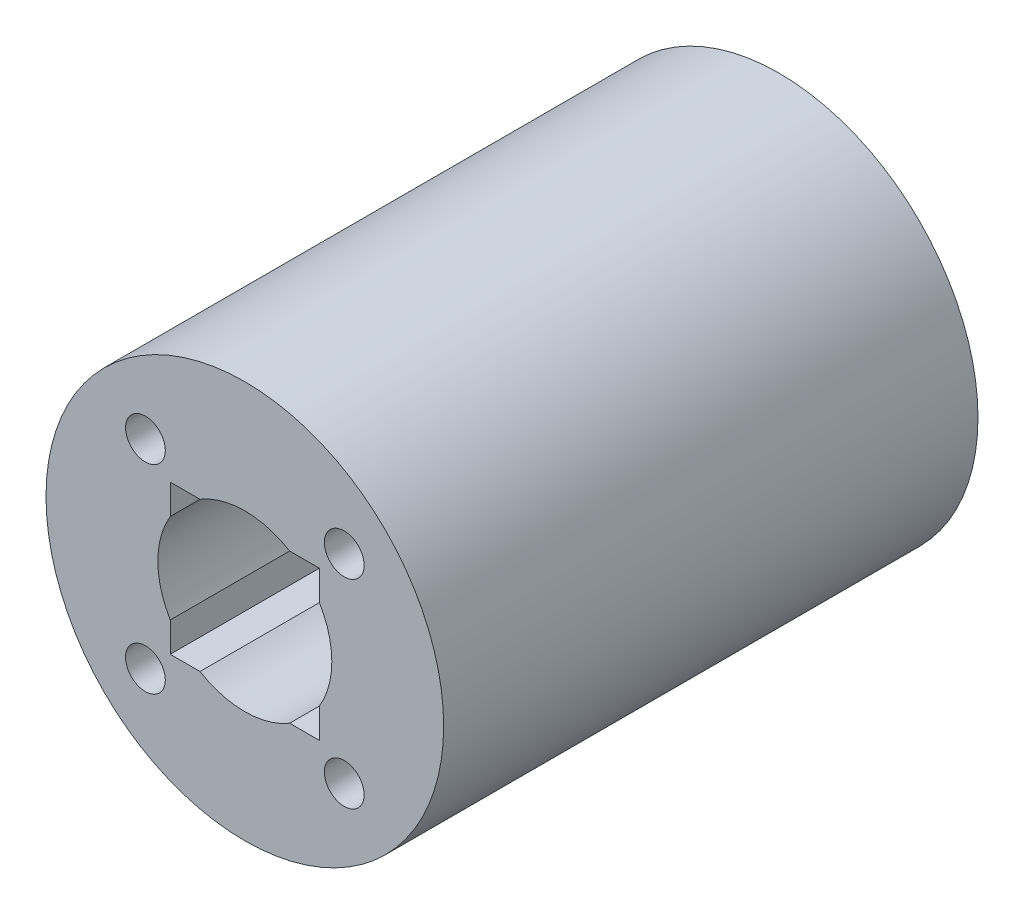
ISO-10303-21;
HEADER;
FILE_DESCRIPTION(('STEP AP214'),'2;1');
FILE_NAME('part.step','',(''),(''),'','','');
FILE_SCHEMA(('AUTOMOTIVE_DESIGN { 1 0 10303 214 1 1 1 1 }'));
ENDSEC;
DATA;
#1=APPLICATION_CONTEXT('core data for automotive mechanical design processes');
#2=APPLICATION_PROTOCOL_DEFINITION('international standard','automotive_design',2000,#1);
#3=PRODUCT_CONTEXT('',#1,'mechanical');
#4=PRODUCT('Part','Part','',(#3));
#5=PRODUCT_RELATED_PRODUCT_CATEGORY('part','',(#4));
#6=PRODUCT_DEFINITION_FORMATION('','',#4);
#7=PRODUCT_DEFINITION_CONTEXT('part definition',#1,'design');
#8=PRODUCT_DEFINITION('design','',#6,#7);
#9=PRODUCT_DEFINITION_SHAPE('','',#8);
#10=(LENGTH_UNIT() NAMED_UNIT(*) SI_UNIT(.MILLI.,.METRE.));
#11=(NAMED_UNIT(*) PLANE_ANGLE_UNIT() SI_UNIT($,.RADIAN.));
#12=(NAMED_UNIT(*) SI_UNIT($,.STERADIAN.) SOLID_ANGLE_UNIT());
#13=UNCERTAINTY_MEASURE_WITH_UNIT(LENGTH_MEASURE(1.E-05),#10,'distance_accuracy_value','');
#14=(GEOMETRIC_REPRESENTATION_CONTEXT(3) GLOBAL_UNCERTAINTY_ASSIGNED_CONTEXT((#13)) GLOBAL_UNIT_ASSIGNED_CONTEXT((#10,
#11,#12)) REPRESENTATION_CONTEXT('',''));
#15=CARTESIAN_POINT('',(0.,0.,0.));
#16=DIRECTION('',(0.,0.,1.));
#17=DIRECTION('',(1.,0.,0.));
#18=AXIS2_PLACEMENT_3D('',#15,#16,#17);
#19=CARTESIAN_POINT('',(0.,0.,43.));
#20=DIRECTION('',(0.,0.,-1.));
#21=DIRECTION('',(-1.,0.,0.));
#22=AXIS2_PLACEMENT_3D('',#19,#20,#21);
#23=CYLINDRICAL_SURFACE('',#22,7.);
#24=CARTESIAN_POINT('',(0.,0.,0.));
#25=DIRECTION('',(0.,0.,1.));
#26=DIRECTION('',(1.,0.,0.));
#27=AXIS2_PLACEMENT_3D('',#24,#25,#26);
#28=CIRCLE('',#27,7.);
#29=CARTESIAN_POINT('',(3.60555127546399,6.,0.));
#30=VERTEX_POINT('',#29);
#31=CARTESIAN_POINT('',(-3.60555127546399,6.,0.));
#32=VERTEX_POINT('',#31);
#33=EDGE_CURVE('E191',#30,#32,#28,.T.);
#34=ORIENTED_EDGE('',*,*,#33,.F.);
#35=DIRECTION('',(0.,0.,-1.));
#36=VECTOR('',#35,1.);
#37=CARTESIAN_POINT('',(3.60555127546399,6.,43.));
#38=LINE('',#37,#36);
#39=CARTESIAN_POINT('',(3.60555127546399,6.,43.));
#40=VERTEX_POINT('',#39);
#41=EDGE_CURVE('E11',#40,#30,#38,.T.);
#42=ORIENTED_EDGE('',*,*,#41,.F.);
#43=CARTESIAN_POINT('',(0.,0.,43.));
#44=DIRECTION('',(0.,0.,1.));
#45=DIRECTION('',(1.,0.,0.));
#46=AXIS2_PLACEMENT_3D('',#43,#44,#45);
#47=CIRCLE('',#46,7.);
#48=CARTESIAN_POINT('',(-3.60555127546399,6.,43.));
#49=VERTEX_POINT('',#48);
#50=EDGE_CURVE('E152',#40,#49,#47,.T.);
#51=ORIENTED_EDGE('',*,*,#50,.T.);
#52=DIRECTION('',(0.,0.,-1.));
#53=VECTOR('',#52,1.);
#54=CARTESIAN_POINT('',(-3.60555127546399,6.,43.));
#55=LINE('',#54,#53);
#56=EDGE_CURVE('E98',#49,#32,#55,.T.);
#57=ORIENTED_EDGE('',*,*,#56,.T.);
#58=EDGE_LOOP('',(#34,#42,#51,#57));
#59=FACE_BOUND('',#58,.T.);
#60=ADVANCED_FACE('F35',(#59),#23,.F.);
#61=CARTESIAN_POINT('',(0.,6.,43.));
#62=DIRECTION('',(0.,1.,0.));
#63=DIRECTION('',(0.,0.,1.));
#64=AXIS2_PLACEMENT_3D('',#61,#62,#63);
#65=PLANE('',#64);
#66=DIRECTION('',(1.,0.,0.));
#67=VECTOR('',#66,1.);
#68=CARTESIAN_POINT('',(0.,6.,0.));
#69=LINE('',#68,#67);
#70=CARTESIAN_POINT('',(6.,6.,0.));
#71=VERTEX_POINT('',#70);
#72=EDGE_CURVE('E194',#30,#71,#69,.T.);
#73=ORIENTED_EDGE('',*,*,#72,.T.);
#74=DIRECTION('',(0.,0.,-1.));
#75=VECTOR('',#74,1.);
#76=CARTESIAN_POINT('',(6.,6.,43.));
#77=LINE('',#76,#75);
#78=CARTESIAN_POINT('',(6.,6.,43.));
#79=VERTEX_POINT('',#78);
#80=EDGE_CURVE('E44',#79,#71,#77,.T.);
#81=ORIENTED_EDGE('',*,*,#80,.F.);
#82=DIRECTION('',(1.,0.,0.));
#83=VECTOR('',#82,1.);
#84=CARTESIAN_POINT('',(0.,6.,43.));
#85=LINE('',#84,#83);
#86=EDGE_CURVE('E158',#40,#79,#85,.T.);
#87=ORIENTED_EDGE('',*,*,#86,.F.);
#88=ORIENTED_EDGE('',*,*,#41,.T.);
#89=EDGE_LOOP('',(#73,#81,#87,#88));
#90=FACE_BOUND('',#89,.T.);
#91=ADVANCED_FACE('F242',(#90),#65,.F.);
#92=CARTESIAN_POINT('',(6.,0.,43.));
#93=DIRECTION('',(-1.,0.,0.));
#94=DIRECTION('',(0.,0.,1.));
#95=AXIS2_PLACEMENT_3D('',#92,#93,#94);
#96=PLANE('',#95);
#97=DIRECTION('',(0.,1.,0.));
#98=VECTOR('',#97,1.);
#99=CARTESIAN_POINT('',(6.,0.,0.));
#100=LINE('',#99,#98);
#101=CARTESIAN_POINT('',(6.,3.60555127546399,0.));
#102=VERTEX_POINT('',#101);
#103=EDGE_CURVE('E198',#102,#71,#100,.T.);
#104=ORIENTED_EDGE('',*,*,#103,.F.);
#105=DIRECTION('',(0.,0.,-1.));
#106=VECTOR('',#105,1.);
#107=CARTESIAN_POINT('',(6.,3.60555127546399,43.));
#108=LINE('',#107,#106);
#109=CARTESIAN_POINT('',(6.,3.60555127546399,43.));
#110=VERTEX_POINT('',#109);
#111=EDGE_CURVE('E235',#110,#102,#108,.T.);
#112=ORIENTED_EDGE('',*,*,#111,.F.);
#113=DIRECTION('',(0.,1.,0.));
#114=VECTOR('',#113,1.);
#115=CARTESIAN_POINT('',(6.,0.,43.));
#116=LINE('',#115,#114);
#117=EDGE_CURVE('E160',#110,#79,#116,.T.);
#118=ORIENTED_EDGE('',*,*,#117,.T.);
#119=ORIENTED_EDGE('',*,*,#80,.T.);
#120=EDGE_LOOP('',(#104,#112,#118,#119));
#121=FACE_BOUND('',#120,.T.);
#122=ADVANCED_FACE('F238',(#121),#96,.T.);
#123=CARTESIAN_POINT('',(6.,-3.60555127546399,0.));
#124=VERTEX_POINT('',#123);
#125=EDGE_CURVE('E195',#124,#102,#28,.T.);
#126=ORIENTED_EDGE('',*,*,#125,.F.);
#127=DIRECTION('',(0.,0.,-1.));
#128=VECTOR('',#127,1.);
#129=CARTESIAN_POINT('',(6.,-3.60555127546399,43.));
#130=LINE('',#129,#128);
#131=CARTESIAN_POINT('',(6.,-3.60555127546399,43.));
#132=VERTEX_POINT('',#131);
#133=EDGE_CURVE('E233',#132,#124,#130,.T.);
#134=ORIENTED_EDGE('',*,*,#133,.F.);
#135=EDGE_CURVE('E157',#132,#110,#47,.T.);
#136=ORIENTED_EDGE('',*,*,#135,.T.);
#137=ORIENTED_EDGE('',*,*,#111,.T.);
#138=EDGE_LOOP('',(#126,#134,#136,#137));
#139=FACE_BOUND('',#138,.T.);
#140=ADVANCED_FACE('F258',(#139),#23,.F.);
#141=CARTESIAN_POINT('',(6.,-6.,0.));
#142=VERTEX_POINT('',#141);
#143=EDGE_CURVE('E202',#142,#124,#100,.T.);
#144=ORIENTED_EDGE('',*,*,#143,.F.);
#145=DIRECTION('',(0.,0.,-1.));
#146=VECTOR('',#145,1.);
#147=CARTESIAN_POINT('',(6.,-6.,43.));
#148=LINE('',#147,#146);
#149=CARTESIAN_POINT('',(6.,-6.,43.));
#150=VERTEX_POINT('',#149);
#151=EDGE_CURVE('E231',#150,#142,#148,.T.);
#152=ORIENTED_EDGE('',*,*,#151,.F.);
#153=EDGE_CURVE('E165',#150,#132,#116,.T.);
#154=ORIENTED_EDGE('',*,*,#153,.T.);
#155=ORIENTED_EDGE('',*,*,#133,.T.);
#156=EDGE_LOOP('',(#144,#152,#154,#155));
#157=FACE_BOUND('',#156,.T.);
#158=ADVANCED_FACE('F37',(#157),#96,.T.);
#159=CARTESIAN_POINT('',(0.,-6.,43.));
#160=DIRECTION('',(0.,1.,0.));
#161=DIRECTION('',(0.,0.,1.));
#162=AXIS2_PLACEMENT_3D('',#159,#160,#161);
#163=PLANE('',#162);
#164=DIRECTION('',(1.,0.,0.));
#165=VECTOR('',#164,1.);
#166=CARTESIAN_POINT('',(0.,-6.,0.));
#167=LINE('',#166,#165);
#168=CARTESIAN_POINT('',(3.60555127546399,-6.,0.));
#169=VERTEX_POINT('',#168);
#170=EDGE_CURVE('E203',#169,#142,#167,.T.);
#171=ORIENTED_EDGE('',*,*,#170,.F.);
#172=DIRECTION('',(0.,0.,-1.));
#173=VECTOR('',#172,1.);
#174=CARTESIAN_POINT('',(3.60555127546399,-6.,43.));
#175=LINE('',#174,#173);
#176=CARTESIAN_POINT('',(3.60555127546399,-6.,43.));
#177=VERTEX_POINT('',#176);
#178=EDGE_CURVE('E229',#177,#169,#175,.T.);
#179=ORIENTED_EDGE('',*,*,#178,.F.);
#180=DIRECTION('',(1.,0.,0.));
#181=VECTOR('',#180,1.);
#182=CARTESIAN_POINT('',(0.,-6.,43.));
#183=LINE('',#182,#181);
#184=EDGE_CURVE('E156',#177,#150,#183,.T.);
#185=ORIENTED_EDGE('',*,*,#184,.T.);
#186=ORIENTED_EDGE('',*,*,#151,.T.);
#187=EDGE_LOOP('',(#171,#179,#185,#186));
#188=FACE_BOUND('',#187,.T.);
#189=ADVANCED_FACE('F276',(#188),#163,.T.);
#190=CARTESIAN_POINT('',(-3.60555127546399,-6.,0.));
#191=VERTEX_POINT('',#190);
#192=EDGE_CURVE('E206',#191,#169,#28,.T.);
#193=ORIENTED_EDGE('',*,*,#192,.F.);
#194=DIRECTION('',(0.,0.,-1.));
#195=VECTOR('',#194,1.);
#196=CARTESIAN_POINT('',(-3.60555127546399,-6.,43.));
#197=LINE('',#196,#195);
#198=CARTESIAN_POINT('',(-3.60555127546399,-6.,43.));
#199=VERTEX_POINT('',#198);
#200=EDGE_CURVE('E227',#199,#191,#197,.T.);
#201=ORIENTED_EDGE('',*,*,#200,.F.);
#202=EDGE_CURVE('E151',#199,#177,#47,.T.);
#203=ORIENTED_EDGE('',*,*,#202,.T.);
#204=ORIENTED_EDGE('',*,*,#178,.T.);
#205=EDGE_LOOP('',(#193,#201,#203,#204));
#206=FACE_BOUND('',#205,.T.);
#207=ADVANCED_FACE('F265',(#206),#23,.F.);
#208=CARTESIAN_POINT('',(-6.,-6.,0.));
#209=VERTEX_POINT('',#208);
#210=EDGE_CURVE('E207',#209,#191,#167,.T.);
#211=ORIENTED_EDGE('',*,*,#210,.F.);
#212=DIRECTION('',(0.,0.,-1.));
#213=VECTOR('',#212,1.);
#214=CARTESIAN_POINT('',(-6.,-6.,43.));
#215=LINE('',#214,#213);
#216=CARTESIAN_POINT('',(-6.,-6.,43.));
#217=VERTEX_POINT('',#216);
#218=EDGE_CURVE('E225',#217,#209,#215,.T.);
#219=ORIENTED_EDGE('',*,*,#218,.F.);
#220=EDGE_CURVE('E153',#217,#199,#183,.T.);
#221=ORIENTED_EDGE('',*,*,#220,.T.);
#222=ORIENTED_EDGE('',*,*,#200,.T.);
#223=EDGE_LOOP('',(#211,#219,#221,#222));
#224=FACE_BOUND('',#223,.T.);
#225=ADVANCED_FACE('F273',(#224),#163,.T.);
#226=CARTESIAN_POINT('',(-6.,0.,43.));
#227=DIRECTION('',(-1.,0.,0.));
#228=DIRECTION('',(0.,0.,1.));
#229=AXIS2_PLACEMENT_3D('',#226,#227,#228);
#230=PLANE('',#229);
#231=DIRECTION('',(0.,1.,0.));
#232=VECTOR('',#231,1.);
#233=CARTESIAN_POINT('',(-6.,0.,0.));
#234=LINE('',#233,#232);
#235=CARTESIAN_POINT('',(-6.,-3.60555127546399,0.));
#236=VERTEX_POINT('',#235);
#237=EDGE_CURVE('E208',#209,#236,#234,.T.);
#238=ORIENTED_EDGE('',*,*,#237,.T.);
#239=DIRECTION('',(0.,0.,-1.));
#240=VECTOR('',#239,1.);
#241=CARTESIAN_POINT('',(-6.,-3.60555127546399,43.));
#242=LINE('',#241,#240);
#243=CARTESIAN_POINT('',(-6.,-3.60555127546399,43.));
#244=VERTEX_POINT('',#243);
#245=EDGE_CURVE('E138',#244,#236,#242,.T.);
#246=ORIENTED_EDGE('',*,*,#245,.F.);
#247=DIRECTION('',(0.,1.,0.));
#248=VECTOR('',#247,1.);
#249=CARTESIAN_POINT('',(-6.,0.,43.));
#250=LINE('',#249,#248);
#251=EDGE_CURVE('E144',#217,#244,#250,.T.);
#252=ORIENTED_EDGE('',*,*,#251,.F.);
#253=ORIENTED_EDGE('',*,*,#218,.T.);
#254=EDGE_LOOP('',(#238,#246,#252,#253));
#255=FACE_BOUND('',#254,.T.);
#256=ADVANCED_FACE('F267',(#255),#230,.F.);
#257=CARTESIAN_POINT('',(-6.,3.60555127546399,0.));
#258=VERTEX_POINT('',#257);
#259=EDGE_CURVE('E137',#258,#236,#28,.T.);
#260=ORIENTED_EDGE('',*,*,#259,.F.);
#261=DIRECTION('',(0.,0.,-1.));
#262=VECTOR('',#261,1.);
#263=CARTESIAN_POINT('',(-6.,3.60555127546399,43.));
#264=LINE('',#263,#262);
#265=CARTESIAN_POINT('',(-6.,3.60555127546399,43.));
#266=VERTEX_POINT('',#265);
#267=EDGE_CURVE('E131',#266,#258,#264,.T.);
#268=ORIENTED_EDGE('',*,*,#267,.F.);
#269=EDGE_CURVE('E135',#266,#244,#47,.T.);
#270=ORIENTED_EDGE('',*,*,#269,.T.);
#271=ORIENTED_EDGE('',*,*,#245,.T.);
#272=EDGE_LOOP('',(#260,#268,#270,#271));
#273=FACE_BOUND('',#272,.T.);
#274=ADVANCED_FACE('F133',(#273),#23,.F.);
#275=CARTESIAN_POINT('',(-6.,6.,0.));
#276=VERTEX_POINT('',#275);
#277=EDGE_CURVE('E91',#258,#276,#234,.T.);
#278=ORIENTED_EDGE('',*,*,#277,.T.);
#279=DIRECTION('',(0.,0.,-1.));
#280=VECTOR('',#279,1.);
#281=CARTESIAN_POINT('',(-6.,6.,43.));
#282=LINE('',#281,#280);
#283=CARTESIAN_POINT('',(-6.,6.,43.));
#284=VERTEX_POINT('',#283);
#285=EDGE_CURVE('E139',#284,#276,#282,.T.);
#286=ORIENTED_EDGE('',*,*,#285,.F.);
#287=EDGE_CURVE('E141',#266,#284,#250,.T.);
#288=ORIENTED_EDGE('',*,*,#287,.F.);
#289=ORIENTED_EDGE('',*,*,#267,.T.);
#290=EDGE_LOOP('',(#278,#286,#288,#289));
#291=FACE_BOUND('',#290,.T.);
#292=ADVANCED_FACE('F142',(#291),#230,.F.);
#293=CARTESIAN_POINT('',(-8.,8.,43.));
#294=DIRECTION('',(0.,0.,-1.));
#295=DIRECTION('',(-1.,0.,0.));
#296=AXIS2_PLACEMENT_3D('',#293,#294,#295);
#297=CYLINDRICAL_SURFACE('',#296,1.6);
#298=CARTESIAN_POINT('',(-8.,8.,43.));
#299=DIRECTION('',(0.,0.,1.));
#300=DIRECTION('',(1.,0.,0.));
#301=AXIS2_PLACEMENT_3D('',#298,#299,#300);
#302=CIRCLE('',#301,1.6);
#303=CARTESIAN_POINT('',(-6.4,8.,43.));
#304=VERTEX_POINT('',#303);
#305=EDGE_CURVE('E185',#304,#304,#302,.T.);
#306=ORIENTED_EDGE('',*,*,#305,.T.);
#307=EDGE_LOOP('',(#306));
#308=FACE_BOUND('',#307,.T.);
#309=CARTESIAN_POINT('',(-8.,8.,0.));
#310=DIRECTION('',(0.,0.,1.));
#311=DIRECTION('',(1.,0.,0.));
#312=AXIS2_PLACEMENT_3D('',#309,#310,#311);
#313=CIRCLE('',#312,1.6);
#314=CARTESIAN_POINT('',(-6.4,8.,0.));
#315=VERTEX_POINT('',#314);
#316=EDGE_CURVE('E162',#315,#315,#313,.T.);
#317=ORIENTED_EDGE('',*,*,#316,.F.);
#318=EDGE_LOOP('',(#317));
#319=FACE_BOUND('',#318,.T.);
#320=ADVANCED_FACE('F272',(#308,#319),#297,.F.);
#321=CARTESIAN_POINT('',(8.00000000000003,7.99999999999997,43.));
#322=DIRECTION('',(0.,0.,-1.));
#323=DIRECTION('',(-1.,0.,0.));
#324=AXIS2_PLACEMENT_3D('',#321,#322,#323);
#325=CYLINDRICAL_SURFACE('',#324,1.6);
#326=CARTESIAN_POINT('',(8.00000000000003,7.99999999999997,43.));
#327=DIRECTION('',(0.,0.,1.));
#328=DIRECTION('',(1.,0.,0.));
#329=AXIS2_PLACEMENT_3D('',#326,#327,#328);
#330=CIRCLE('',#329,1.6);
#331=CARTESIAN_POINT('',(9.60000000000003,7.99999999999997,43.));
#332=VERTEX_POINT('',#331);
#333=EDGE_CURVE('E182',#332,#332,#330,.T.);
#334=ORIENTED_EDGE('',*,*,#333,.T.);
#335=EDGE_LOOP('',(#334));
#336=FACE_BOUND('',#335,.T.);
#337=CARTESIAN_POINT('',(8.00000000000003,7.99999999999997,0.));
#338=DIRECTION('',(0.,0.,1.));
#339=DIRECTION('',(1.,0.,0.));
#340=AXIS2_PLACEMENT_3D('',#337,#338,#339);
#341=CIRCLE('',#340,1.6);
#342=CARTESIAN_POINT('',(9.60000000000003,7.99999999999997,0.));
#343=VERTEX_POINT('',#342);
#344=EDGE_CURVE('E217',#343,#343,#341,.T.);
#345=ORIENTED_EDGE('',*,*,#344,.F.);
#346=EDGE_LOOP('',(#345));
#347=FACE_BOUND('',#346,.T.);
#348=ADVANCED_FACE('F348',(#336,#347),#325,.F.);
#349=CARTESIAN_POINT('',(7.99999999999994,-8.00000000000006,43.));
#350=DIRECTION('',(0.,0.,-1.));
#351=DIRECTION('',(-1.,0.,0.));
#352=AXIS2_PLACEMENT_3D('',#349,#350,#351);
#353=CYLINDRICAL_SURFACE('',#352,1.6);
#354=CARTESIAN_POINT('',(7.99999999999994,-8.00000000000006,43.));
#355=DIRECTION('',(0.,0.,1.));
#356=DIRECTION('',(1.,0.,0.));
#357=AXIS2_PLACEMENT_3D('',#354,#355,#356);
#358=CIRCLE('',#357,1.6);
#359=CARTESIAN_POINT('',(9.59999999999995,-8.00000000000006,43.));
#360=VERTEX_POINT('',#359);
#361=EDGE_CURVE('E179',#360,#360,#358,.T.);
#362=ORIENTED_EDGE('',*,*,#361,.T.);
#363=EDGE_LOOP('',(#362));
#364=FACE_BOUND('',#363,.T.);
#365=CARTESIAN_POINT('',(7.99999999999994,-8.00000000000006,0.));
#366=DIRECTION('',(0.,0.,1.));
#367=DIRECTION('',(1.,0.,0.));
#368=AXIS2_PLACEMENT_3D('',#365,#366,#367);
#369=CIRCLE('',#368,1.6);
#370=CARTESIAN_POINT('',(9.59999999999995,-8.00000000000006,0.));
#371=VERTEX_POINT('',#370);
#372=EDGE_CURVE('E214',#371,#371,#369,.T.);
#373=ORIENTED_EDGE('',*,*,#372,.F.);
#374=EDGE_LOOP('',(#373));
#375=FACE_BOUND('',#374,.T.);
#376=ADVANCED_FACE('F358',(#364,#375),#353,.F.);
#377=CARTESIAN_POINT('',(-8.00000000000008,-7.99999999999992,43.));
#378=DIRECTION('',(0.,0.,-1.));
#379=DIRECTION('',(-1.,0.,0.));
#380=AXIS2_PLACEMENT_3D('',#377,#378,#379);
#381=CYLINDRICAL_SURFACE('',#380,1.6);
#382=CARTESIAN_POINT('',(-8.00000000000008,-7.99999999999992,43.));
#383=DIRECTION('',(0.,0.,1.));
#384=DIRECTION('',(1.,0.,0.));
#385=AXIS2_PLACEMENT_3D('',#382,#383,#384);
#386=CIRCLE('',#385,1.6);
#387=CARTESIAN_POINT('',(-6.40000000000008,-7.99999999999992,43.));
#388=VERTEX_POINT('',#387);
#389=EDGE_CURVE('E176',#388,#388,#386,.T.);
#390=ORIENTED_EDGE('',*,*,#389,.T.);
#391=EDGE_LOOP('',(#390));
#392=FACE_BOUND('',#391,.T.);
#393=CARTESIAN_POINT('',(-8.00000000000008,-7.99999999999992,0.));
#394=DIRECTION('',(0.,0.,1.));
#395=DIRECTION('',(1.,0.,0.));
#396=AXIS2_PLACEMENT_3D('',#393,#394,#395);
#397=CIRCLE('',#396,1.6);
#398=CARTESIAN_POINT('',(-6.40000000000008,-7.99999999999992,0.));
#399=VERTEX_POINT('',#398);
#400=EDGE_CURVE('E211',#399,#399,#397,.T.);
#401=ORIENTED_EDGE('',*,*,#400,.F.);
#402=EDGE_LOOP('',(#401));
#403=FACE_BOUND('',#402,.T.);
#404=ADVANCED_FACE('F368',(#392,#403),#381,.F.);
#405=EDGE_CURVE('E199',#276,#32,#69,.T.);
#406=ORIENTED_EDGE('',*,*,#405,.T.);
#407=ORIENTED_EDGE('',*,*,#56,.F.);
#408=EDGE_CURVE('E52',#284,#49,#85,.T.);
#409=ORIENTED_EDGE('',*,*,#408,.F.);
#410=ORIENTED_EDGE('',*,*,#285,.T.);
#411=EDGE_LOOP('',(#406,#407,#409,#410));
#412=FACE_BOUND('',#411,.T.);
#413=ADVANCED_FACE('F255',(#412),#65,.F.);
#414=CARTESIAN_POINT('',(0.,0.,43.));
#415=DIRECTION('',(0.,0.,-1.));
#416=DIRECTION('',(-1.,0.,0.));
#417=AXIS2_PLACEMENT_3D('',#414,#415,#416);
#418=CYLINDRICAL_SURFACE('',#417,16.);
#419=CARTESIAN_POINT('',(0.,0.,43.));
#420=DIRECTION('',(0.,0.,1.));
#421=DIRECTION('',(1.,0.,0.));
#422=AXIS2_PLACEMENT_3D('',#419,#420,#421);
#423=CIRCLE('',#422,16.);
#424=CARTESIAN_POINT('',(16.,0.,43.));
#425=VERTEX_POINT('',#424);
#426=EDGE_CURVE('E188',#425,#425,#423,.T.);
#427=ORIENTED_EDGE('',*,*,#426,.F.);
#428=EDGE_LOOP('',(#427));
#429=FACE_BOUND('',#428,.T.);
#430=CARTESIAN_POINT('',(0.,0.,0.));
#431=DIRECTION('',(0.,0.,1.));
#432=DIRECTION('',(1.,0.,0.));
#433=AXIS2_PLACEMENT_3D('',#430,#431,#432);
#434=CIRCLE('',#433,16.);
#435=CARTESIAN_POINT('',(16.,0.,0.));
#436=VERTEX_POINT('',#435);
#437=EDGE_CURVE('E159',#436,#436,#434,.T.);
#438=ORIENTED_EDGE('',*,*,#437,.T.);
#439=EDGE_LOOP('',(#438));
#440=FACE_BOUND('',#439,.T.);
#441=ADVANCED_FACE('F387',(#429,#440),#418,.T.);
#442=CARTESIAN_POINT('',(0.,0.,43.));
#443=DIRECTION('',(0.,0.,1.));
#444=DIRECTION('',(1.,0.,0.));
#445=AXIS2_PLACEMENT_3D('',#442,#443,#444);
#446=PLANE('',#445);
#447=ORIENTED_EDGE('',*,*,#50,.F.);
#448=ORIENTED_EDGE('',*,*,#86,.T.);
#449=ORIENTED_EDGE('',*,*,#117,.F.);
#450=ORIENTED_EDGE('',*,*,#135,.F.);
#451=ORIENTED_EDGE('',*,*,#153,.F.);
#452=ORIENTED_EDGE('',*,*,#184,.F.);
#453=ORIENTED_EDGE('',*,*,#202,.F.);
#454=ORIENTED_EDGE('',*,*,#220,.F.);
#455=ORIENTED_EDGE('',*,*,#251,.T.);
#456=ORIENTED_EDGE('',*,*,#269,.F.);
#457=ORIENTED_EDGE('',*,*,#287,.T.);
#458=ORIENTED_EDGE('',*,*,#408,.T.);
#459=EDGE_LOOP('',(#447,#448,#449,#450,#451,#452,#453,#454,#455,#456,#457,#458));
#460=FACE_BOUND('',#459,.T.);
#461=ORIENTED_EDGE('',*,*,#389,.F.);
#462=EDGE_LOOP('',(#461));
#463=FACE_BOUND('',#462,.T.);
#464=ORIENTED_EDGE('',*,*,#361,.F.);
#465=EDGE_LOOP('',(#464));
#466=FACE_BOUND('',#465,.T.);
#467=ORIENTED_EDGE('',*,*,#333,.F.);
#468=EDGE_LOOP('',(#467));
#469=FACE_BOUND('',#468,.T.);
#470=ORIENTED_EDGE('',*,*,#305,.F.);
#471=EDGE_LOOP('',(#470));
#472=FACE_BOUND('',#471,.T.);
#473=ORIENTED_EDGE('',*,*,#426,.T.);
#474=EDGE_LOOP('',(#473));
#475=FACE_BOUND('',#474,.T.);
#476=ADVANCED_FACE('F145',(#460,#463,#466,#469,#472,#475),#446,.T.);
#477=CARTESIAN_POINT('',(0.,0.,0.));
#478=DIRECTION('',(0.,0.,1.));
#479=DIRECTION('',(1.,0.,0.));
#480=AXIS2_PLACEMENT_3D('',#477,#478,#479);
#481=PLANE('',#480);
#482=ORIENTED_EDGE('',*,*,#33,.T.);
#483=ORIENTED_EDGE('',*,*,#405,.F.);
#484=ORIENTED_EDGE('',*,*,#277,.F.);
#485=ORIENTED_EDGE('',*,*,#259,.T.);
#486=ORIENTED_EDGE('',*,*,#237,.F.);
#487=ORIENTED_EDGE('',*,*,#210,.T.);
#488=ORIENTED_EDGE('',*,*,#192,.T.);
#489=ORIENTED_EDGE('',*,*,#170,.T.);
#490=ORIENTED_EDGE('',*,*,#143,.T.);
#491=ORIENTED_EDGE('',*,*,#125,.T.);
#492=ORIENTED_EDGE('',*,*,#103,.T.);
#493=ORIENTED_EDGE('',*,*,#72,.F.);
#494=EDGE_LOOP('',(#482,#483,#484,#485,#486,#487,#488,#489,#490,#491,#492,#493));
#495=FACE_BOUND('',#494,.T.);
#496=ORIENTED_EDGE('',*,*,#400,.T.);
#497=EDGE_LOOP('',(#496));
#498=FACE_BOUND('',#497,.T.);
#499=ORIENTED_EDGE('',*,*,#372,.T.);
#500=EDGE_LOOP('',(#499));
#501=FACE_BOUND('',#500,.T.);
#502=ORIENTED_EDGE('',*,*,#344,.T.);
#503=EDGE_LOOP('',(#502));
#504=FACE_BOUND('',#503,.T.);
#505=ORIENTED_EDGE('',*,*,#316,.T.);
#506=EDGE_LOOP('',(#505));
#507=FACE_BOUND('',#506,.T.);
#508=ORIENTED_EDGE('',*,*,#437,.F.);
#509=EDGE_LOOP('',(#508));
#510=FACE_BOUND('',#509,.T.);
#511=ADVANCED_FACE('F244',(#495,#498,#501,#504,#507,#510),#481,.F.);
#512=CLOSED_SHELL('',(#60,#91,#122,#140,#158,#189,#207,#225,#256,#274,#292,#320,#348,#376,#404,
#413,#441,#476,#511));
#513=MANIFOLD_SOLID_BREP('B2',#512);
#514=ADVANCED_BREP_SHAPE_REPRESENTATION('',(#18,#513),#14);
#515=SHAPE_DEFINITION_REPRESENTATION(#9,#514);
ENDSEC;
END-ISO-10303-21;
